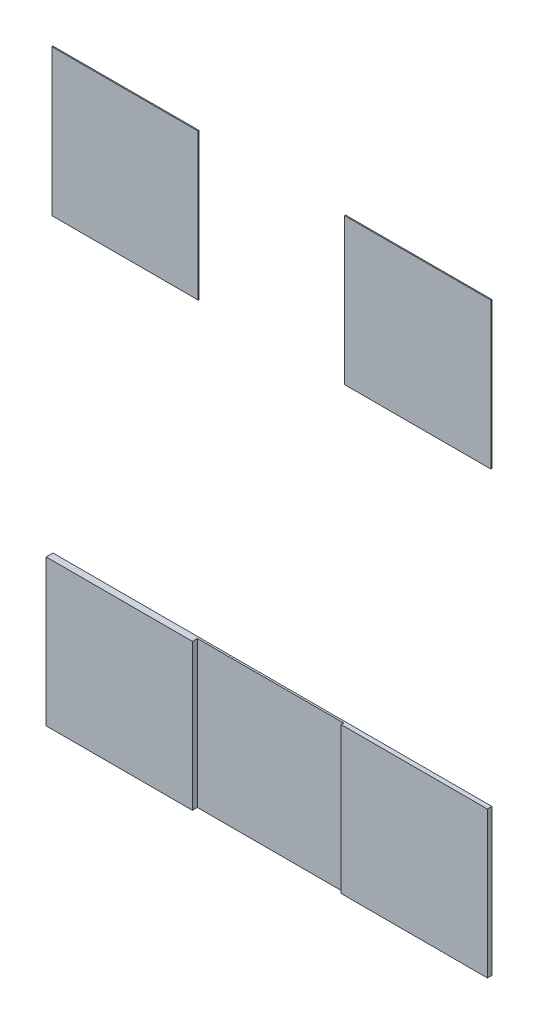
ISO-10303-21;
HEADER;
FILE_DESCRIPTION(('STEP AP214'),'2;1');
FILE_NAME('part.step','',(''),(''),'','','');
FILE_SCHEMA(('AUTOMOTIVE_DESIGN { 1 0 10303 214 1 1 1 1 }'));
ENDSEC;
DATA;
#1=APPLICATION_CONTEXT('core data for automotive mechanical design processes');
#2=APPLICATION_PROTOCOL_DEFINITION('international standard','automotive_design',2000,#1);
#3=PRODUCT_CONTEXT('',#1,'mechanical');
#4=PRODUCT('Part','Part','',(#3));
#5=PRODUCT_RELATED_PRODUCT_CATEGORY('part','',(#4));
#6=PRODUCT_DEFINITION_FORMATION('','',#4);
#7=PRODUCT_DEFINITION_CONTEXT('part definition',#1,'design');
#8=PRODUCT_DEFINITION('design','',#6,#7);
#9=PRODUCT_DEFINITION_SHAPE('','',#8);
#10=(LENGTH_UNIT() NAMED_UNIT(*) SI_UNIT(.MILLI.,.METRE.));
#11=(NAMED_UNIT(*) PLANE_ANGLE_UNIT() SI_UNIT($,.RADIAN.));
#12=(NAMED_UNIT(*) SI_UNIT($,.STERADIAN.) SOLID_ANGLE_UNIT());
#13=UNCERTAINTY_MEASURE_WITH_UNIT(LENGTH_MEASURE(1.E-05),#10,'distance_accuracy_value','');
#14=(GEOMETRIC_REPRESENTATION_CONTEXT(3) GLOBAL_UNCERTAINTY_ASSIGNED_CONTEXT((#13)) GLOBAL_UNIT_ASSIGNED_CONTEXT((#10,
#11,#12)) REPRESENTATION_CONTEXT('',''));
#15=CARTESIAN_POINT('',(0.,0.,0.));
#16=DIRECTION('',(0.,0.,1.));
#17=DIRECTION('',(1.,0.,0.));
#18=AXIS2_PLACEMENT_3D('',#15,#16,#17);
#19=CARTESIAN_POINT('',(1380.,1840.,3.4007521));
#20=DIRECTION('',(1.,0.,0.));
#21=DIRECTION('',(0.,0.,-1.));
#22=AXIS2_PLACEMENT_3D('',#19,#20,#21);
#23=PLANE('',#22);
#24=DIRECTION('',(0.,-1.,0.));
#25=VECTOR('',#24,1.);
#26=CARTESIAN_POINT('',(1380.,1840.,0.));
#27=LINE('',#26,#25);
#28=CARTESIAN_POINT('',(1380.,2300.,0.));
#29=VERTEX_POINT('',#28);
#30=CARTESIAN_POINT('',(1380.,1840.,0.));
#31=VERTEX_POINT('',#30);
#32=EDGE_CURVE('E113',#29,#31,#27,.T.);
#33=ORIENTED_EDGE('',*,*,#32,.T.);
#34=DIRECTION('',(0.,0.,-1.));
#35=VECTOR('',#34,1.);
#36=CARTESIAN_POINT('',(1380.,1840.,3.4007521));
#37=LINE('',#36,#35);
#38=CARTESIAN_POINT('',(1380.,1840.,3.4007521));
#39=VERTEX_POINT('',#38);
#40=EDGE_CURVE('E12',#39,#31,#37,.T.);
#41=ORIENTED_EDGE('',*,*,#40,.F.);
#42=DIRECTION('',(0.,-1.,0.));
#43=VECTOR('',#42,1.);
#44=CARTESIAN_POINT('',(1380.,1840.,3.4007521));
#45=LINE('',#44,#43);
#46=CARTESIAN_POINT('',(1380.,2300.,3.4007521));
#47=VERTEX_POINT('',#46);
#48=EDGE_CURVE('E101',#47,#39,#45,.T.);
#49=ORIENTED_EDGE('',*,*,#48,.F.);
#50=DIRECTION('',(0.,0.,-1.));
#51=VECTOR('',#50,1.);
#52=CARTESIAN_POINT('',(1380.,2300.,3.4007521));
#53=LINE('',#52,#51);
#54=EDGE_CURVE('E109',#47,#29,#53,.T.);
#55=ORIENTED_EDGE('',*,*,#54,.T.);
#56=EDGE_LOOP('',(#33,#41,#49,#55));
#57=FACE_BOUND('',#56,.T.);
#58=ADVANCED_FACE('F50',(#57),#23,.F.);
#59=CARTESIAN_POINT('',(1380.,1840.,3.4007521));
#60=DIRECTION('',(0.,1.,0.));
#61=DIRECTION('',(0.,0.,1.));
#62=AXIS2_PLACEMENT_3D('',#59,#60,#61);
#63=PLANE('',#62);
#64=DIRECTION('',(1.,0.,0.));
#65=VECTOR('',#64,1.);
#66=CARTESIAN_POINT('',(1380.,1840.,0.));
#67=LINE('',#66,#65);
#68=CARTESIAN_POINT('',(1840.,1840.,0.));
#69=VERTEX_POINT('',#68);
#70=EDGE_CURVE('E105',#31,#69,#67,.T.);
#71=ORIENTED_EDGE('',*,*,#70,.T.);
#72=DIRECTION('',(0.,0.,-1.));
#73=VECTOR('',#72,1.);
#74=CARTESIAN_POINT('',(1840.,1840.,3.4007521));
#75=LINE('',#74,#73);
#76=CARTESIAN_POINT('',(1840.,1840.,3.4007521));
#77=VERTEX_POINT('',#76);
#78=EDGE_CURVE('E58',#77,#69,#75,.T.);
#79=ORIENTED_EDGE('',*,*,#78,.F.);
#80=DIRECTION('',(1.,0.,0.));
#81=VECTOR('',#80,1.);
#82=CARTESIAN_POINT('',(1380.,1840.,3.4007521));
#83=LINE('',#82,#81);
#84=EDGE_CURVE('E96',#39,#77,#83,.T.);
#85=ORIENTED_EDGE('',*,*,#84,.F.);
#86=ORIENTED_EDGE('',*,*,#40,.T.);
#87=EDGE_LOOP('',(#71,#79,#85,#86));
#88=FACE_BOUND('',#87,.T.);
#89=ADVANCED_FACE('F104',(#88),#63,.F.);
#90=CARTESIAN_POINT('',(1840.,1840.,3.4007521));
#91=DIRECTION('',(-1.,0.,0.));
#92=DIRECTION('',(0.,0.,1.));
#93=AXIS2_PLACEMENT_3D('',#90,#91,#92);
#94=PLANE('',#93);
#95=DIRECTION('',(0.,1.,0.));
#96=VECTOR('',#95,1.);
#97=CARTESIAN_POINT('',(1840.,1840.,0.));
#98=LINE('',#97,#96);
#99=CARTESIAN_POINT('',(1840.,2300.,0.));
#100=VERTEX_POINT('',#99);
#101=EDGE_CURVE('E83',#69,#100,#98,.T.);
#102=ORIENTED_EDGE('',*,*,#101,.T.);
#103=DIRECTION('',(0.,0.,-1.));
#104=VECTOR('',#103,1.);
#105=CARTESIAN_POINT('',(1840.,2300.,3.4007521));
#106=LINE('',#105,#104);
#107=CARTESIAN_POINT('',(1840.,2300.,3.4007521));
#108=VERTEX_POINT('',#107);
#109=EDGE_CURVE('E106',#108,#100,#106,.T.);
#110=ORIENTED_EDGE('',*,*,#109,.F.);
#111=DIRECTION('',(0.,1.,0.));
#112=VECTOR('',#111,1.);
#113=CARTESIAN_POINT('',(1840.,1840.,3.4007521));
#114=LINE('',#113,#112);
#115=EDGE_CURVE('E99',#77,#108,#114,.T.);
#116=ORIENTED_EDGE('',*,*,#115,.F.);
#117=ORIENTED_EDGE('',*,*,#78,.T.);
#118=EDGE_LOOP('',(#102,#110,#116,#117));
#119=FACE_BOUND('',#118,.T.);
#120=ADVANCED_FACE('F107',(#119),#94,.F.);
#121=CARTESIAN_POINT('',(1380.,2300.,3.4007521));
#122=DIRECTION('',(0.,-1.,0.));
#123=DIRECTION('',(0.,0.,-1.));
#124=AXIS2_PLACEMENT_3D('',#121,#122,#123);
#125=PLANE('',#124);
#126=DIRECTION('',(-1.,0.,0.));
#127=VECTOR('',#126,1.);
#128=CARTESIAN_POINT('',(1380.,2300.,0.));
#129=LINE('',#128,#127);
#130=EDGE_CURVE('E89',#100,#29,#129,.T.);
#131=ORIENTED_EDGE('',*,*,#130,.T.);
#132=ORIENTED_EDGE('',*,*,#54,.F.);
#133=DIRECTION('',(-1.,0.,0.));
#134=VECTOR('',#133,1.);
#135=CARTESIAN_POINT('',(1380.,2300.,3.4007521));
#136=LINE('',#135,#134);
#137=EDGE_CURVE('E66',#108,#47,#136,.T.);
#138=ORIENTED_EDGE('',*,*,#137,.F.);
#139=ORIENTED_EDGE('',*,*,#109,.T.);
#140=EDGE_LOOP('',(#131,#132,#138,#139));
#141=FACE_BOUND('',#140,.T.);
#142=ADVANCED_FACE('F120',(#141),#125,.F.);
#143=CARTESIAN_POINT('',(0.,0.,3.4007521));
#144=DIRECTION('',(0.,0.,-1.));
#145=DIRECTION('',(-1.,0.,0.));
#146=AXIS2_PLACEMENT_3D('',#143,#144,#145);
#147=PLANE('',#146);
#148=ORIENTED_EDGE('',*,*,#48,.T.);
#149=ORIENTED_EDGE('',*,*,#84,.T.);
#150=ORIENTED_EDGE('',*,*,#115,.T.);
#151=ORIENTED_EDGE('',*,*,#137,.T.);
#152=EDGE_LOOP('',(#148,#149,#150,#151));
#153=FACE_BOUND('',#152,.T.);
#154=ADVANCED_FACE('F97',(#153),#147,.F.);
#155=CARTESIAN_POINT('',(0.,0.,0.));
#156=DIRECTION('',(0.,0.,-1.));
#157=DIRECTION('',(-1.,0.,0.));
#158=AXIS2_PLACEMENT_3D('',#155,#156,#157);
#159=PLANE('',#158);
#160=ORIENTED_EDGE('',*,*,#32,.F.);
#161=ORIENTED_EDGE('',*,*,#130,.F.);
#162=ORIENTED_EDGE('',*,*,#101,.F.);
#163=ORIENTED_EDGE('',*,*,#70,.F.);
#164=EDGE_LOOP('',(#160,#161,#162,#163));
#165=FACE_BOUND('',#164,.T.);
#166=ADVANCED_FACE('F123',(#165),#159,.T.);
#167=CLOSED_SHELL('',(#58,#89,#120,#142,#154,#166));
#168=MANIFOLD_SOLID_BREP('B2',#167);
#169=CARTESIAN_POINT('',(460.,1840.,3.4007521));
#170=DIRECTION('',(1.,0.,0.));
#171=DIRECTION('',(0.,0.,-1.));
#172=AXIS2_PLACEMENT_3D('',#169,#170,#171);
#173=PLANE('',#172);
#174=DIRECTION('',(0.,-1.,0.));
#175=VECTOR('',#174,1.);
#176=CARTESIAN_POINT('',(460.,1840.,0.));
#177=LINE('',#176,#175);
#178=CARTESIAN_POINT('',(460.,2300.,0.));
#179=VERTEX_POINT('',#178);
#180=CARTESIAN_POINT('',(460.,1840.,0.));
#181=VERTEX_POINT('',#180);
#182=EDGE_CURVE('E246',#179,#181,#177,.T.);
#183=ORIENTED_EDGE('',*,*,#182,.T.);
#184=DIRECTION('',(0.,0.,-1.));
#185=VECTOR('',#184,1.);
#186=CARTESIAN_POINT('',(460.,1840.,3.4007521));
#187=LINE('',#186,#185);
#188=CARTESIAN_POINT('',(460.,1840.,3.4007521));
#189=VERTEX_POINT('',#188);
#190=EDGE_CURVE('E48',#189,#181,#187,.T.);
#191=ORIENTED_EDGE('',*,*,#190,.F.);
#192=DIRECTION('',(0.,-1.,0.));
#193=VECTOR('',#192,1.);
#194=CARTESIAN_POINT('',(460.,1840.,3.4007521));
#195=LINE('',#194,#193);
#196=CARTESIAN_POINT('',(460.,2300.,3.4007521));
#197=VERTEX_POINT('',#196);
#198=EDGE_CURVE('E234',#197,#189,#195,.T.);
#199=ORIENTED_EDGE('',*,*,#198,.F.);
#200=DIRECTION('',(0.,0.,-1.));
#201=VECTOR('',#200,1.);
#202=CARTESIAN_POINT('',(460.,2300.,3.4007521));
#203=LINE('',#202,#201);
#204=EDGE_CURVE('E242',#197,#179,#203,.T.);
#205=ORIENTED_EDGE('',*,*,#204,.T.);
#206=EDGE_LOOP('',(#183,#191,#199,#205));
#207=FACE_BOUND('',#206,.T.);
#208=ADVANCED_FACE('F183',(#207),#173,.F.);
#209=CARTESIAN_POINT('',(460.,1840.,3.4007521));
#210=DIRECTION('',(0.,1.,0.));
#211=DIRECTION('',(0.,0.,1.));
#212=AXIS2_PLACEMENT_3D('',#209,#210,#211);
#213=PLANE('',#212);
#214=DIRECTION('',(1.,0.,0.));
#215=VECTOR('',#214,1.);
#216=CARTESIAN_POINT('',(460.,1840.,0.));
#217=LINE('',#216,#215);
#218=CARTESIAN_POINT('',(920.,1840.,0.));
#219=VERTEX_POINT('',#218);
#220=EDGE_CURVE('E238',#181,#219,#217,.T.);
#221=ORIENTED_EDGE('',*,*,#220,.T.);
#222=DIRECTION('',(0.,0.,-1.));
#223=VECTOR('',#222,1.);
#224=CARTESIAN_POINT('',(920.,1840.,3.4007521));
#225=LINE('',#224,#223);
#226=CARTESIAN_POINT('',(920.,1840.,3.4007521));
#227=VERTEX_POINT('',#226);
#228=EDGE_CURVE('E191',#227,#219,#225,.T.);
#229=ORIENTED_EDGE('',*,*,#228,.F.);
#230=DIRECTION('',(1.,0.,0.));
#231=VECTOR('',#230,1.);
#232=CARTESIAN_POINT('',(460.,1840.,3.4007521));
#233=LINE('',#232,#231);
#234=EDGE_CURVE('E229',#189,#227,#233,.T.);
#235=ORIENTED_EDGE('',*,*,#234,.F.);
#236=ORIENTED_EDGE('',*,*,#190,.T.);
#237=EDGE_LOOP('',(#221,#229,#235,#236));
#238=FACE_BOUND('',#237,.T.);
#239=ADVANCED_FACE('F237',(#238),#213,.F.);
#240=CARTESIAN_POINT('',(920.,1840.,3.4007521));
#241=DIRECTION('',(-1.,0.,0.));
#242=DIRECTION('',(0.,0.,1.));
#243=AXIS2_PLACEMENT_3D('',#240,#241,#242);
#244=PLANE('',#243);
#245=DIRECTION('',(0.,1.,0.));
#246=VECTOR('',#245,1.);
#247=CARTESIAN_POINT('',(920.,1840.,0.));
#248=LINE('',#247,#246);
#249=CARTESIAN_POINT('',(920.,2300.,0.));
#250=VERTEX_POINT('',#249);
#251=EDGE_CURVE('E216',#219,#250,#248,.T.);
#252=ORIENTED_EDGE('',*,*,#251,.T.);
#253=DIRECTION('',(0.,0.,-1.));
#254=VECTOR('',#253,1.);
#255=CARTESIAN_POINT('',(920.,2300.,3.4007521));
#256=LINE('',#255,#254);
#257=CARTESIAN_POINT('',(920.,2300.,3.4007521));
#258=VERTEX_POINT('',#257);
#259=EDGE_CURVE('E239',#258,#250,#256,.T.);
#260=ORIENTED_EDGE('',*,*,#259,.F.);
#261=DIRECTION('',(0.,1.,0.));
#262=VECTOR('',#261,1.);
#263=CARTESIAN_POINT('',(920.,1840.,3.4007521));
#264=LINE('',#263,#262);
#265=EDGE_CURVE('E232',#227,#258,#264,.T.);
#266=ORIENTED_EDGE('',*,*,#265,.F.);
#267=ORIENTED_EDGE('',*,*,#228,.T.);
#268=EDGE_LOOP('',(#252,#260,#266,#267));
#269=FACE_BOUND('',#268,.T.);
#270=ADVANCED_FACE('F240',(#269),#244,.F.);
#271=CARTESIAN_POINT('',(460.,2300.,3.4007521));
#272=DIRECTION('',(0.,-1.,0.));
#273=DIRECTION('',(0.,0.,-1.));
#274=AXIS2_PLACEMENT_3D('',#271,#272,#273);
#275=PLANE('',#274);
#276=DIRECTION('',(-1.,0.,0.));
#277=VECTOR('',#276,1.);
#278=CARTESIAN_POINT('',(460.,2300.,0.));
#279=LINE('',#278,#277);
#280=EDGE_CURVE('E222',#250,#179,#279,.T.);
#281=ORIENTED_EDGE('',*,*,#280,.T.);
#282=ORIENTED_EDGE('',*,*,#204,.F.);
#283=DIRECTION('',(-1.,0.,0.));
#284=VECTOR('',#283,1.);
#285=CARTESIAN_POINT('',(460.,2300.,3.4007521));
#286=LINE('',#285,#284);
#287=EDGE_CURVE('E199',#258,#197,#286,.T.);
#288=ORIENTED_EDGE('',*,*,#287,.F.);
#289=ORIENTED_EDGE('',*,*,#259,.T.);
#290=EDGE_LOOP('',(#281,#282,#288,#289));
#291=FACE_BOUND('',#290,.T.);
#292=ADVANCED_FACE('F253',(#291),#275,.F.);
#293=CARTESIAN_POINT('',(0.,0.,3.4007521));
#294=DIRECTION('',(0.,0.,-1.));
#295=DIRECTION('',(-1.,0.,0.));
#296=AXIS2_PLACEMENT_3D('',#293,#294,#295);
#297=PLANE('',#296);
#298=ORIENTED_EDGE('',*,*,#198,.T.);
#299=ORIENTED_EDGE('',*,*,#234,.T.);
#300=ORIENTED_EDGE('',*,*,#265,.T.);
#301=ORIENTED_EDGE('',*,*,#287,.T.);
#302=EDGE_LOOP('',(#298,#299,#300,#301));
#303=FACE_BOUND('',#302,.T.);
#304=ADVANCED_FACE('F230',(#303),#297,.F.);
#305=CARTESIAN_POINT('',(0.,0.,0.));
#306=DIRECTION('',(0.,0.,-1.));
#307=DIRECTION('',(-1.,0.,0.));
#308=AXIS2_PLACEMENT_3D('',#305,#306,#307);
#309=PLANE('',#308);
#310=ORIENTED_EDGE('',*,*,#182,.F.);
#311=ORIENTED_EDGE('',*,*,#280,.F.);
#312=ORIENTED_EDGE('',*,*,#251,.F.);
#313=ORIENTED_EDGE('',*,*,#220,.F.);
#314=EDGE_LOOP('',(#310,#311,#312,#313));
#315=FACE_BOUND('',#314,.T.);
#316=ADVANCED_FACE('F256',(#315),#309,.T.);
#317=CLOSED_SHELL('',(#208,#239,#270,#292,#304,#316));
#318=MANIFOLD_SOLID_BREP('B6',#317);
#319=CARTESIAN_POINT('',(920.,460.,21.4200203));
#320=DIRECTION('',(-1.,0.,0.));
#321=DIRECTION('',(0.,0.,1.));
#322=AXIS2_PLACEMENT_3D('',#319,#320,#321);
#323=PLANE('',#322);
#324=DIRECTION('',(0.,-1.,0.));
#325=VECTOR('',#324,1.);
#326=CARTESIAN_POINT('',(920.,460.,5.8470921));
#327=LINE('',#326,#325);
#328=CARTESIAN_POINT('',(920.,920.,5.8470921));
#329=VERTEX_POINT('',#328);
#330=CARTESIAN_POINT('',(920.,460.,5.8470921));
#331=VERTEX_POINT('',#330);
#332=EDGE_CURVE('E322',#329,#331,#327,.T.);
#333=ORIENTED_EDGE('',*,*,#332,.F.);
#334=DIRECTION('',(0.,0.,-1.));
#335=VECTOR('',#334,1.);
#336=CARTESIAN_POINT('',(920.,920.,21.4200203));
#337=LINE('',#336,#335);
#338=CARTESIAN_POINT('',(920.,920.,21.4200203));
#339=VERTEX_POINT('',#338);
#340=EDGE_CURVE('E431',#339,#329,#337,.T.);
#341=ORIENTED_EDGE('',*,*,#340,.F.);
#342=DIRECTION('',(0.,1.,0.));
#343=VECTOR('',#342,1.);
#344=CARTESIAN_POINT('',(920.,460.,21.4200203));
#345=LINE('',#344,#343);
#346=CARTESIAN_POINT('',(920.,460.,21.4200203));
#347=VERTEX_POINT('',#346);
#348=EDGE_CURVE('E421',#347,#339,#345,.T.);
#349=ORIENTED_EDGE('',*,*,#348,.F.);
#350=DIRECTION('',(0.,0.,-1.));
#351=VECTOR('',#350,1.);
#352=CARTESIAN_POINT('',(920.,460.,21.4200203));
#353=LINE('',#352,#351);
#354=EDGE_CURVE('E315',#347,#331,#353,.T.);
#355=ORIENTED_EDGE('',*,*,#354,.T.);
#356=EDGE_LOOP('',(#333,#341,#349,#355));
#357=FACE_BOUND('',#356,.T.);
#358=ADVANCED_FACE('F307',(#357),#323,.F.);
#359=CARTESIAN_POINT('',(460.,460.,21.4200203));
#360=DIRECTION('',(1.,0.,0.));
#361=DIRECTION('',(0.,0.,-1.));
#362=AXIS2_PLACEMENT_3D('',#359,#360,#361);
#363=PLANE('',#362);
#364=DIRECTION('',(0.,-1.,0.));
#365=VECTOR('',#364,1.);
#366=CARTESIAN_POINT('',(460.,460.,0.));
#367=LINE('',#366,#365);
#368=CARTESIAN_POINT('',(460.,920.,0.));
#369=VERTEX_POINT('',#368);
#370=CARTESIAN_POINT('',(460.,460.,0.));
#371=VERTEX_POINT('',#370);
#372=EDGE_CURVE('E417',#369,#371,#367,.T.);
#373=ORIENTED_EDGE('',*,*,#372,.T.);
#374=DIRECTION('',(0.,0.,-1.));
#375=VECTOR('',#374,1.);
#376=CARTESIAN_POINT('',(460.,460.,21.4200203));
#377=LINE('',#376,#375);
#378=CARTESIAN_POINT('',(460.,460.,21.4200203));
#379=VERTEX_POINT('',#378);
#380=EDGE_CURVE('E181',#379,#371,#377,.T.);
#381=ORIENTED_EDGE('',*,*,#380,.F.);
#382=DIRECTION('',(0.,-1.,0.));
#383=VECTOR('',#382,1.);
#384=CARTESIAN_POINT('',(460.,460.,21.4200203));
#385=LINE('',#384,#383);
#386=CARTESIAN_POINT('',(460.,920.,21.4200203));
#387=VERTEX_POINT('',#386);
#388=EDGE_CURVE('E418',#387,#379,#385,.T.);
#389=ORIENTED_EDGE('',*,*,#388,.F.);
#390=DIRECTION('',(0.,0.,-1.));
#391=VECTOR('',#390,1.);
#392=CARTESIAN_POINT('',(460.,920.,21.4200203));
#393=LINE('',#392,#391);
#394=EDGE_CURVE('E424',#387,#369,#393,.T.);
#395=ORIENTED_EDGE('',*,*,#394,.T.);
#396=EDGE_LOOP('',(#373,#381,#389,#395));
#397=FACE_BOUND('',#396,.T.);
#398=ADVANCED_FACE('F309',(#397),#363,.F.);
#399=CARTESIAN_POINT('',(460.,460.,21.4200203));
#400=DIRECTION('',(0.,1.,0.));
#401=DIRECTION('',(0.,0.,1.));
#402=AXIS2_PLACEMENT_3D('',#399,#400,#401);
#403=PLANE('',#402);
#404=DIRECTION('',(1.,0.,0.));
#405=VECTOR('',#404,1.);
#406=CARTESIAN_POINT('',(460.,460.,0.));
#407=LINE('',#406,#405);
#408=CARTESIAN_POINT('',(1840.,460.,0.));
#409=VERTEX_POINT('',#408);
#410=EDGE_CURVE('E427',#371,#409,#407,.T.);
#411=ORIENTED_EDGE('',*,*,#410,.T.);
#412=DIRECTION('',(0.,0.,-1.));
#413=VECTOR('',#412,1.);
#414=CARTESIAN_POINT('',(1840.,460.,14.156868));
#415=LINE('',#414,#413);
#416=CARTESIAN_POINT('',(1840.,460.,14.156868));
#417=VERTEX_POINT('',#416);
#418=EDGE_CURVE('E388',#417,#409,#415,.T.);
#419=ORIENTED_EDGE('',*,*,#418,.F.);
#420=DIRECTION('',(1.,0.,0.));
#421=VECTOR('',#420,1.);
#422=CARTESIAN_POINT('',(1380.,460.,14.156868));
#423=LINE('',#422,#421);
#424=CARTESIAN_POINT('',(1380.,460.,14.156868));
#425=VERTEX_POINT('',#424);
#426=EDGE_CURVE('E380',#425,#417,#423,.T.);
#427=ORIENTED_EDGE('',*,*,#426,.F.);
#428=DIRECTION('',(0.,0.,-1.));
#429=VECTOR('',#428,1.);
#430=CARTESIAN_POINT('',(1380.,460.,14.156868));
#431=LINE('',#430,#429);
#432=CARTESIAN_POINT('',(1380.,460.,5.8470921));
#433=VERTEX_POINT('',#432);
#434=EDGE_CURVE('E385',#425,#433,#431,.T.);
#435=ORIENTED_EDGE('',*,*,#434,.T.);
#436=DIRECTION('',(1.,0.,0.));
#437=VECTOR('',#436,1.);
#438=CARTESIAN_POINT('',(920.,460.,5.8470921));
#439=LINE('',#438,#437);
#440=EDGE_CURVE('E406',#331,#433,#439,.T.);
#441=ORIENTED_EDGE('',*,*,#440,.F.);
#442=ORIENTED_EDGE('',*,*,#354,.F.);
#443=DIRECTION('',(1.,0.,0.));
#444=VECTOR('',#443,1.);
#445=CARTESIAN_POINT('',(460.,460.,21.4200203));
#446=LINE('',#445,#444);
#447=EDGE_CURVE('E353',#379,#347,#446,.T.);
#448=ORIENTED_EDGE('',*,*,#447,.F.);
#449=ORIENTED_EDGE('',*,*,#380,.T.);
#450=EDGE_LOOP('',(#411,#419,#427,#435,#441,#442,#448,#449));
#451=FACE_BOUND('',#450,.T.);
#452=ADVANCED_FACE('F382',(#451),#403,.F.);
#453=CARTESIAN_POINT('',(460.,920.,21.4200203));
#454=DIRECTION('',(0.,-1.,0.));
#455=DIRECTION('',(0.,0.,-1.));
#456=AXIS2_PLACEMENT_3D('',#453,#454,#455);
#457=PLANE('',#456);
#458=DIRECTION('',(-1.,0.,0.));
#459=VECTOR('',#458,1.);
#460=CARTESIAN_POINT('',(460.,920.,0.));
#461=LINE('',#460,#459);
#462=CARTESIAN_POINT('',(1840.,920.,0.));
#463=VERTEX_POINT('',#462);
#464=EDGE_CURVE('E346',#463,#369,#461,.T.);
#465=ORIENTED_EDGE('',*,*,#464,.T.);
#466=ORIENTED_EDGE('',*,*,#394,.F.);
#467=DIRECTION('',(-1.,0.,0.));
#468=VECTOR('',#467,1.);
#469=CARTESIAN_POINT('',(460.,920.,21.4200203));
#470=LINE('',#469,#468);
#471=EDGE_CURVE('E331',#339,#387,#470,.T.);
#472=ORIENTED_EDGE('',*,*,#471,.F.);
#473=ORIENTED_EDGE('',*,*,#340,.T.);
#474=DIRECTION('',(-1.,0.,0.));
#475=VECTOR('',#474,1.);
#476=CARTESIAN_POINT('',(920.,920.,5.8470921));
#477=LINE('',#476,#475);
#478=CARTESIAN_POINT('',(1380.,920.,5.8470921));
#479=VERTEX_POINT('',#478);
#480=EDGE_CURVE('E414',#479,#329,#477,.T.);
#481=ORIENTED_EDGE('',*,*,#480,.F.);
#482=DIRECTION('',(0.,0.,-1.));
#483=VECTOR('',#482,1.);
#484=CARTESIAN_POINT('',(1380.,920.,14.156868));
#485=LINE('',#484,#483);
#486=CARTESIAN_POINT('',(1380.,920.,14.156868));
#487=VERTEX_POINT('',#486);
#488=EDGE_CURVE('E437',#487,#479,#485,.T.);
#489=ORIENTED_EDGE('',*,*,#488,.F.);
#490=DIRECTION('',(-1.,0.,0.));
#491=VECTOR('',#490,1.);
#492=CARTESIAN_POINT('',(1380.,920.,14.156868));
#493=LINE('',#492,#491);
#494=CARTESIAN_POINT('',(1840.,920.,14.156868));
#495=VERTEX_POINT('',#494);
#496=EDGE_CURVE('E397',#495,#487,#493,.T.);
#497=ORIENTED_EDGE('',*,*,#496,.F.);
#498=DIRECTION('',(0.,0.,-1.));
#499=VECTOR('',#498,1.);
#500=CARTESIAN_POINT('',(1840.,920.,14.156868));
#501=LINE('',#500,#499);
#502=EDGE_CURVE('E408',#495,#463,#501,.T.);
#503=ORIENTED_EDGE('',*,*,#502,.T.);
#504=EDGE_LOOP('',(#465,#466,#472,#473,#481,#489,#497,#503));
#505=FACE_BOUND('',#504,.T.);
#506=ADVANCED_FACE('F436',(#505),#457,.F.);
#507=CARTESIAN_POINT('',(0.,0.,21.4200203));
#508=DIRECTION('',(0.,0.,-1.));
#509=DIRECTION('',(-1.,0.,0.));
#510=AXIS2_PLACEMENT_3D('',#507,#508,#509);
#511=PLANE('',#510);
#512=ORIENTED_EDGE('',*,*,#388,.T.);
#513=ORIENTED_EDGE('',*,*,#447,.T.);
#514=ORIENTED_EDGE('',*,*,#348,.T.);
#515=ORIENTED_EDGE('',*,*,#471,.T.);
#516=EDGE_LOOP('',(#512,#513,#514,#515));
#517=FACE_BOUND('',#516,.T.);
#518=ADVANCED_FACE('F442',(#517),#511,.F.);
#519=CARTESIAN_POINT('',(0.,0.,0.));
#520=DIRECTION('',(0.,0.,-1.));
#521=DIRECTION('',(-1.,0.,0.));
#522=AXIS2_PLACEMENT_3D('',#519,#520,#521);
#523=PLANE('',#522);
#524=ORIENTED_EDGE('',*,*,#372,.F.);
#525=ORIENTED_EDGE('',*,*,#464,.F.);
#526=DIRECTION('',(0.,1.,0.));
#527=VECTOR('',#526,1.);
#528=CARTESIAN_POINT('',(1840.,460.,0.));
#529=LINE('',#528,#527);
#530=EDGE_CURVE('E400',#409,#463,#529,.T.);
#531=ORIENTED_EDGE('',*,*,#530,.F.);
#532=ORIENTED_EDGE('',*,*,#410,.F.);
#533=EDGE_LOOP('',(#524,#525,#531,#532));
#534=FACE_BOUND('',#533,.T.);
#535=ADVANCED_FACE('F444',(#534),#523,.T.);
#536=CARTESIAN_POINT('',(0.,0.,5.8470921));
#537=DIRECTION('',(0.,0.,-1.));
#538=DIRECTION('',(-1.,0.,0.));
#539=AXIS2_PLACEMENT_3D('',#536,#537,#538);
#540=PLANE('',#539);
#541=ORIENTED_EDGE('',*,*,#332,.T.);
#542=ORIENTED_EDGE('',*,*,#440,.T.);
#543=DIRECTION('',(0.,1.,0.));
#544=VECTOR('',#543,1.);
#545=CARTESIAN_POINT('',(1380.,460.,5.8470921));
#546=LINE('',#545,#544);
#547=EDGE_CURVE('E404',#433,#479,#546,.T.);
#548=ORIENTED_EDGE('',*,*,#547,.T.);
#549=ORIENTED_EDGE('',*,*,#480,.T.);
#550=EDGE_LOOP('',(#541,#542,#548,#549));
#551=FACE_BOUND('',#550,.T.);
#552=ADVANCED_FACE('F434',(#551),#540,.F.);
#553=CARTESIAN_POINT('',(1380.,460.,14.156868));
#554=DIRECTION('',(1.,0.,0.));
#555=DIRECTION('',(0.,0.,-1.));
#556=AXIS2_PLACEMENT_3D('',#553,#554,#555);
#557=PLANE('',#556);
#558=ORIENTED_EDGE('',*,*,#547,.F.);
#559=ORIENTED_EDGE('',*,*,#434,.F.);
#560=DIRECTION('',(0.,-1.,0.));
#561=VECTOR('',#560,1.);
#562=CARTESIAN_POINT('',(1380.,460.,14.156868));
#563=LINE('',#562,#561);
#564=EDGE_CURVE('E392',#487,#425,#563,.T.);
#565=ORIENTED_EDGE('',*,*,#564,.F.);
#566=ORIENTED_EDGE('',*,*,#488,.T.);
#567=EDGE_LOOP('',(#558,#559,#565,#566));
#568=FACE_BOUND('',#567,.T.);
#569=ADVANCED_FACE('F402',(#568),#557,.F.);
#570=CARTESIAN_POINT('',(1840.,460.,14.156868));
#571=DIRECTION('',(-1.,0.,0.));
#572=DIRECTION('',(0.,0.,1.));
#573=AXIS2_PLACEMENT_3D('',#570,#571,#572);
#574=PLANE('',#573);
#575=ORIENTED_EDGE('',*,*,#530,.T.);
#576=ORIENTED_EDGE('',*,*,#502,.F.);
#577=DIRECTION('',(0.,1.,0.));
#578=VECTOR('',#577,1.);
#579=CARTESIAN_POINT('',(1840.,460.,14.156868));
#580=LINE('',#579,#578);
#581=EDGE_CURVE('E391',#417,#495,#580,.T.);
#582=ORIENTED_EDGE('',*,*,#581,.F.);
#583=ORIENTED_EDGE('',*,*,#418,.T.);
#584=EDGE_LOOP('',(#575,#576,#582,#583));
#585=FACE_BOUND('',#584,.T.);
#586=ADVANCED_FACE('F485',(#585),#574,.F.);
#587=CARTESIAN_POINT('',(0.,0.,14.156868));
#588=DIRECTION('',(0.,0.,-1.));
#589=DIRECTION('',(-1.,0.,0.));
#590=AXIS2_PLACEMENT_3D('',#587,#588,#589);
#591=PLANE('',#590);
#592=ORIENTED_EDGE('',*,*,#564,.T.);
#593=ORIENTED_EDGE('',*,*,#426,.T.);
#594=ORIENTED_EDGE('',*,*,#581,.T.);
#595=ORIENTED_EDGE('',*,*,#496,.T.);
#596=EDGE_LOOP('',(#592,#593,#594,#595));
#597=FACE_BOUND('',#596,.T.);
#598=ADVANCED_FACE('F395',(#597),#591,.F.);
#599=CLOSED_SHELL('',(#358,#398,#452,#506,#518,#535,#552,#569,#586,#598));
#600=MANIFOLD_SOLID_BREP('B42',#599);
#601=ADVANCED_BREP_SHAPE_REPRESENTATION('',(#18,#168,#318,#600),#14);
#602=SHAPE_DEFINITION_REPRESENTATION(#9,#601);
ENDSEC;
END-ISO-10303-21;
